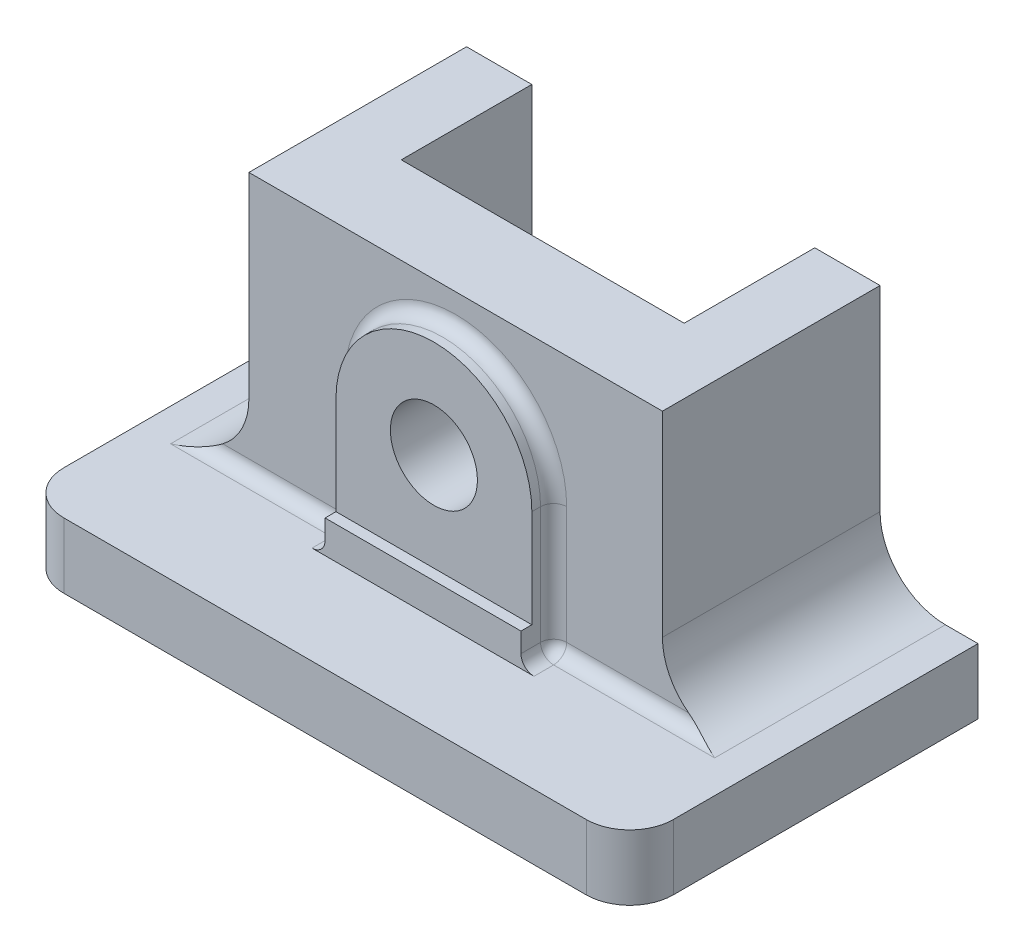
ISO-10303-21;
HEADER;
FILE_DESCRIPTION(('STEP AP214'),'2;1');
FILE_NAME('part.step','',(''),(''),'','','');
FILE_SCHEMA(('AUTOMOTIVE_DESIGN { 1 0 10303 214 1 1 1 1 }'));
ENDSEC;
DATA;
#1=APPLICATION_CONTEXT('core data for automotive mechanical design processes');
#2=APPLICATION_PROTOCOL_DEFINITION('international standard','automotive_design',2000,#1);
#3=PRODUCT_CONTEXT('',#1,'mechanical');
#4=PRODUCT('Part','Part','',(#3));
#5=PRODUCT_RELATED_PRODUCT_CATEGORY('part','',(#4));
#6=PRODUCT_DEFINITION_FORMATION('','',#4);
#7=PRODUCT_DEFINITION_CONTEXT('part definition',#1,'design');
#8=PRODUCT_DEFINITION('design','',#6,#7);
#9=PRODUCT_DEFINITION_SHAPE('','',#8);
#10=(LENGTH_UNIT() NAMED_UNIT(*) SI_UNIT(.MILLI.,.METRE.));
#11=(NAMED_UNIT(*) PLANE_ANGLE_UNIT() SI_UNIT($,.RADIAN.));
#12=(NAMED_UNIT(*) SI_UNIT($,.STERADIAN.) SOLID_ANGLE_UNIT());
#13=UNCERTAINTY_MEASURE_WITH_UNIT(LENGTH_MEASURE(1.E-05),#10,'distance_accuracy_value','');
#14=(GEOMETRIC_REPRESENTATION_CONTEXT(3) GLOBAL_UNCERTAINTY_ASSIGNED_CONTEXT((#13)) GLOBAL_UNIT_ASSIGNED_CONTEXT((#10,
#11,#12)) REPRESENTATION_CONTEXT('',''));
#15=CARTESIAN_POINT('',(0.,0.,0.));
#16=DIRECTION('',(0.,0.,1.));
#17=DIRECTION('',(1.,0.,0.));
#18=AXIS2_PLACEMENT_3D('',#15,#16,#17);
#19=CARTESIAN_POINT('',(-38.1,9.525,19.05));
#20=DIRECTION('',(0.,-1.,0.));
#21=DIRECTION('',(0.,0.,-1.));
#22=AXIS2_PLACEMENT_3D('',#19,#20,#21);
#23=PLANE('',#22);
#24=DIRECTION('',(1.,0.,0.));
#25=VECTOR('',#24,1.);
#26=CARTESIAN_POINT('',(0.,9.525,11.1125));
#27=LINE('',#26,#25);
#28=CARTESIAN_POINT('',(-16.1925,9.525,11.1125));
#29=VERTEX_POINT('',#28);
#30=CARTESIAN_POINT('',(16.1925,9.525,11.1125));
#31=VERTEX_POINT('',#30);
#32=EDGE_CURVE('E232',#29,#31,#27,.T.);
#33=ORIENTED_EDGE('',*,*,#32,.F.);
#34=DIRECTION('',(0.,0.,-1.));
#35=VECTOR('',#34,1.);
#36=CARTESIAN_POINT('',(-16.1925,9.525,19.05));
#37=LINE('',#36,#35);
#38=CARTESIAN_POINT('',(-16.1925,9.525,8.25499999999999));
#39=VERTEX_POINT('',#38);
#40=EDGE_CURVE('E415',#29,#39,#37,.T.);
#41=ORIENTED_EDGE('',*,*,#40,.T.);
#42=DIRECTION('',(1.,0.,0.));
#43=VECTOR('',#42,1.);
#44=CARTESIAN_POINT('',(-39.6875,9.525,8.25499999999999));
#45=LINE('',#44,#43);
#46=CARTESIAN_POINT('',(-39.6875,9.525,8.25499999999999));
#47=VERTEX_POINT('',#46);
#48=EDGE_CURVE('E412',#39,#47,#45,.F.);
#49=ORIENTED_EDGE('',*,*,#48,.T.);
#50=DIRECTION('',(0.,0.,1.));
#51=VECTOR('',#50,1.);
#52=CARTESIAN_POINT('',(-39.6875,9.525,-25.4));
#53=LINE('',#52,#51);
#54=CARTESIAN_POINT('',(-39.6875,9.525,-25.4));
#55=VERTEX_POINT('',#54);
#56=EDGE_CURVE('E375',#47,#55,#53,.F.);
#57=ORIENTED_EDGE('',*,*,#56,.T.);
#58=DIRECTION('',(-1.,0.,0.));
#59=VECTOR('',#58,1.);
#60=CARTESIAN_POINT('',(-44.45,9.525,-25.4));
#61=LINE('',#60,#59);
#62=CARTESIAN_POINT('',(-44.45,9.525,-25.4));
#63=VERTEX_POINT('',#62);
#64=EDGE_CURVE('E323',#55,#63,#61,.T.);
#65=ORIENTED_EDGE('',*,*,#64,.T.);
#66=DIRECTION('',(0.,0.,1.));
#67=VECTOR('',#66,1.);
#68=CARTESIAN_POINT('',(-44.45,9.525,19.05));
#69=LINE('',#68,#67);
#70=CARTESIAN_POINT('',(-44.45,9.525,19.05));
#71=VERTEX_POINT('',#70);
#72=EDGE_CURVE('E328',#63,#71,#69,.T.);
#73=ORIENTED_EDGE('',*,*,#72,.T.);
#74=CARTESIAN_POINT('',(-38.1,9.525,19.05));
#75=DIRECTION('',(0.,1.,0.));
#76=DIRECTION('',(0.,0.,-1.));
#77=AXIS2_PLACEMENT_3D('',#74,#75,#76);
#78=CIRCLE('',#77,6.35);
#79=CARTESIAN_POINT('',(-38.0999999999999,9.525,25.4));
#80=VERTEX_POINT('',#79);
#81=EDGE_CURVE('E331',#71,#80,#78,.T.);
#82=ORIENTED_EDGE('',*,*,#81,.T.);
#83=DIRECTION('',(1.,0.,0.));
#84=VECTOR('',#83,1.);
#85=CARTESIAN_POINT('',(-38.0999999999999,9.525,25.4));
#86=LINE('',#85,#84);
#87=CARTESIAN_POINT('',(38.1,9.525,25.4));
#88=VERTEX_POINT('',#87);
#89=EDGE_CURVE('E333',#80,#88,#86,.T.);
#90=ORIENTED_EDGE('',*,*,#89,.T.);
#91=CARTESIAN_POINT('',(38.1,9.525,19.05));
#92=DIRECTION('',(0.,1.,0.));
#93=DIRECTION('',(0.,0.,1.));
#94=AXIS2_PLACEMENT_3D('',#91,#92,#93);
#95=CIRCLE('',#94,6.35);
#96=CARTESIAN_POINT('',(44.45,9.525,19.05));
#97=VERTEX_POINT('',#96);
#98=EDGE_CURVE('E335',#88,#97,#95,.T.);
#99=ORIENTED_EDGE('',*,*,#98,.T.);
#100=DIRECTION('',(0.,0.,-1.));
#101=VECTOR('',#100,1.);
#102=CARTESIAN_POINT('',(44.45,9.525,19.05));
#103=LINE('',#102,#101);
#104=CARTESIAN_POINT('',(44.45,9.525,-25.4));
#105=VERTEX_POINT('',#104);
#106=EDGE_CURVE('E320',#97,#105,#103,.T.);
#107=ORIENTED_EDGE('',*,*,#106,.T.);
#108=CARTESIAN_POINT('',(39.6875,9.525,-25.4));
#109=VERTEX_POINT('',#108);
#110=EDGE_CURVE('E325',#105,#109,#61,.T.);
#111=ORIENTED_EDGE('',*,*,#110,.T.);
#112=DIRECTION('',(0.,0.,-1.));
#113=VECTOR('',#112,1.);
#114=CARTESIAN_POINT('',(39.6875,9.525,6.34999999999999));
#115=LINE('',#114,#113);
#116=CARTESIAN_POINT('',(39.6875,9.525,8.25499999999999));
#117=VERTEX_POINT('',#116);
#118=EDGE_CURVE('E373',#109,#117,#115,.F.);
#119=ORIENTED_EDGE('',*,*,#118,.T.);
#120=DIRECTION('',(1.,0.,0.));
#121=VECTOR('',#120,1.);
#122=CARTESIAN_POINT('',(16.1925,9.525,8.25499999999999));
#123=LINE('',#122,#121);
#124=CARTESIAN_POINT('',(16.1925,9.525,8.25499999999999));
#125=VERTEX_POINT('',#124);
#126=EDGE_CURVE('E401',#117,#125,#123,.F.);
#127=ORIENTED_EDGE('',*,*,#126,.T.);
#128=DIRECTION('',(0.,0.,-1.));
#129=VECTOR('',#128,1.);
#130=CARTESIAN_POINT('',(16.1925,9.525,19.05));
#131=LINE('',#130,#129);
#132=EDGE_CURVE('E409',#125,#31,#131,.F.);
#133=ORIENTED_EDGE('',*,*,#132,.T.);
#134=EDGE_LOOP('',(#33,#41,#49,#57,#65,#73,#82,#90,#99,#107,#111,#119,#127,#133));
#135=FACE_BOUND('',#134,.T.);
#136=ADVANCED_FACE('F39',(#135),#23,.F.);
#137=CARTESIAN_POINT('',(30.1625,47.625,6.34999999999999));
#138=DIRECTION('',(0.,0.,-1.));
#139=DIRECTION('',(-1.,0.,0.));
#140=AXIS2_PLACEMENT_3D('',#137,#138,#139);
#141=PLANE('',#140);
#142=CARTESIAN_POINT('',(-39.6875,19.05,6.34999999999999));
#143=DIRECTION('',(0.,0.,-1.));
#144=DIRECTION('',(-1.,0.,0.));
#145=AXIS2_PLACEMENT_3D('',#142,#143,#144);
#146=CIRCLE('',#145,9.525);
#147=CARTESIAN_POINT('',(-30.1625,19.05,6.34999999999999));
#148=VERTEX_POINT('',#147);
#149=CARTESIAN_POINT('',(-33.9725,11.43,6.34999999999999));
#150=VERTEX_POINT('',#149);
#151=EDGE_CURVE('E380',#148,#150,#146,.T.);
#152=ORIENTED_EDGE('',*,*,#151,.T.);
#153=DIRECTION('',(1.,0.,0.));
#154=VECTOR('',#153,1.);
#155=CARTESIAN_POINT('',(-16.1925,11.43,6.34999999999999));
#156=LINE('',#155,#154);
#157=CARTESIAN_POINT('',(-16.1925,11.43,6.34999999999999));
#158=VERTEX_POINT('',#157);
#159=EDGE_CURVE('E427',#150,#158,#156,.T.);
#160=ORIENTED_EDGE('',*,*,#159,.T.);
#161=DIRECTION('',(0.,1.,0.));
#162=VECTOR('',#161,1.);
#163=CARTESIAN_POINT('',(-16.1925,47.625,6.34999999999999));
#164=LINE('',#163,#162);
#165=CARTESIAN_POINT('',(-16.1925,28.575,6.34999999999999));
#166=VERTEX_POINT('',#165);
#167=EDGE_CURVE('E390',#158,#166,#164,.T.);
#168=ORIENTED_EDGE('',*,*,#167,.T.);
#169=CARTESIAN_POINT('',(0.,28.575,6.34999999999999));
#170=DIRECTION('',(0.,0.,-1.));
#171=DIRECTION('',(-1.,0.,0.));
#172=AXIS2_PLACEMENT_3D('',#169,#170,#171);
#173=CIRCLE('',#172,16.1925);
#174=CARTESIAN_POINT('',(16.1925,28.575,6.34999999999999));
#175=VERTEX_POINT('',#174);
#176=EDGE_CURVE('E388',#166,#175,#173,.T.);
#177=ORIENTED_EDGE('',*,*,#176,.T.);
#178=DIRECTION('',(0.,-1.,0.));
#179=VECTOR('',#178,1.);
#180=CARTESIAN_POINT('',(16.1925,47.625,6.34999999999999));
#181=LINE('',#180,#179);
#182=CARTESIAN_POINT('',(16.1925,11.43,6.34999999999999));
#183=VERTEX_POINT('',#182);
#184=EDGE_CURVE('E392',#175,#183,#181,.T.);
#185=ORIENTED_EDGE('',*,*,#184,.T.);
#186=DIRECTION('',(1.,0.,0.));
#187=VECTOR('',#186,1.);
#188=CARTESIAN_POINT('',(39.6875,11.43,6.34999999999999));
#189=LINE('',#188,#187);
#190=CARTESIAN_POINT('',(33.9725,11.43,6.34999999999999));
#191=VERTEX_POINT('',#190);
#192=EDGE_CURVE('E64',#183,#191,#189,.T.);
#193=ORIENTED_EDGE('',*,*,#192,.T.);
#194=CARTESIAN_POINT('',(39.6875,19.05,6.34999999999999));
#195=DIRECTION('',(0.,0.,-1.));
#196=DIRECTION('',(-1.,0.,0.));
#197=AXIS2_PLACEMENT_3D('',#194,#195,#196);
#198=CIRCLE('',#197,9.525);
#199=CARTESIAN_POINT('',(30.1625,19.05,6.34999999999999));
#200=VERTEX_POINT('',#199);
#201=EDGE_CURVE('E386',#191,#200,#198,.T.);
#202=ORIENTED_EDGE('',*,*,#201,.T.);
#203=DIRECTION('',(0.,-1.,0.));
#204=VECTOR('',#203,1.);
#205=CARTESIAN_POINT('',(30.1625,47.625,6.34999999999999));
#206=LINE('',#205,#204);
#207=CARTESIAN_POINT('',(30.1625,47.625,6.34999999999999));
#208=VERTEX_POINT('',#207);
#209=EDGE_CURVE('E301',#208,#200,#206,.T.);
#210=ORIENTED_EDGE('',*,*,#209,.F.);
#211=DIRECTION('',(1.,0.,0.));
#212=VECTOR('',#211,1.);
#213=CARTESIAN_POINT('',(30.1625,47.625,6.34999999999999));
#214=LINE('',#213,#212);
#215=CARTESIAN_POINT('',(-30.1625,47.625,6.34999999999999));
#216=VERTEX_POINT('',#215);
#217=EDGE_CURVE('E282',#216,#208,#214,.T.);
#218=ORIENTED_EDGE('',*,*,#217,.F.);
#219=DIRECTION('',(0.,-1.,0.));
#220=VECTOR('',#219,1.);
#221=CARTESIAN_POINT('',(-30.1625,47.625,6.34999999999999));
#222=LINE('',#221,#220);
#223=EDGE_CURVE('E304',#216,#148,#222,.T.);
#224=ORIENTED_EDGE('',*,*,#223,.T.);
#225=EDGE_LOOP('',(#152,#160,#168,#177,#185,#193,#202,#210,#218,#224));
#226=FACE_BOUND('',#225,.T.);
#227=ADVANCED_FACE('F482',(#226),#141,.F.);
#228=DIRECTION('',(0.,0.,1.));
#229=VECTOR('',#228,1.);
#230=CARTESIAN_POINT('',(20.6375,9.525,-6.35000000000001));
#231=LINE('',#230,#229);
#232=CARTESIAN_POINT('',(20.6375,9.525,-25.4));
#233=VERTEX_POINT('',#232);
#234=CARTESIAN_POINT('',(20.6375,9.525,-6.35000000000001));
#235=VERTEX_POINT('',#234);
#236=EDGE_CURVE('E269',#233,#235,#231,.T.);
#237=ORIENTED_EDGE('',*,*,#236,.F.);
#238=CARTESIAN_POINT('',(-20.6375,9.525,-25.4));
#239=VERTEX_POINT('',#238);
#240=EDGE_CURVE('E329',#233,#239,#61,.T.);
#241=ORIENTED_EDGE('',*,*,#240,.T.);
#242=DIRECTION('',(0.,0.,-1.));
#243=VECTOR('',#242,1.);
#244=CARTESIAN_POINT('',(-20.6375,9.525,-25.4));
#245=LINE('',#244,#243);
#246=CARTESIAN_POINT('',(-20.6375,9.525,-6.35));
#247=VERTEX_POINT('',#246);
#248=EDGE_CURVE('E274',#247,#239,#245,.T.);
#249=ORIENTED_EDGE('',*,*,#248,.F.);
#250=DIRECTION('',(-1.,0.,0.));
#251=VECTOR('',#250,1.);
#252=CARTESIAN_POINT('',(-20.6375,9.525,-6.35));
#253=LINE('',#252,#251);
#254=EDGE_CURVE('E291',#235,#247,#253,.T.);
#255=ORIENTED_EDGE('',*,*,#254,.F.);
#256=EDGE_LOOP('',(#237,#241,#249,#255));
#257=FACE_BOUND('',#256,.T.);
#258=ADVANCED_FACE('F485',(#257),#23,.F.);
#259=CARTESIAN_POINT('',(44.45,9.525,19.05));
#260=DIRECTION('',(-1.,0.,0.));
#261=DIRECTION('',(0.,0.,1.));
#262=AXIS2_PLACEMENT_3D('',#259,#260,#261);
#263=PLANE('',#262);
#264=DIRECTION('',(0.,0.,-1.));
#265=VECTOR('',#264,1.);
#266=CARTESIAN_POINT('',(44.45,0.,19.05));
#267=LINE('',#266,#265);
#268=CARTESIAN_POINT('',(44.45,0.,19.05));
#269=VERTEX_POINT('',#268);
#270=CARTESIAN_POINT('',(44.45,0.,-25.4));
#271=VERTEX_POINT('',#270);
#272=EDGE_CURVE('E319',#269,#271,#267,.T.);
#273=ORIENTED_EDGE('',*,*,#272,.T.);
#274=DIRECTION('',(0.,-1.,0.));
#275=VECTOR('',#274,1.);
#276=CARTESIAN_POINT('',(44.45,9.525,-25.4));
#277=LINE('',#276,#275);
#278=EDGE_CURVE('E363',#105,#271,#277,.T.);
#279=ORIENTED_EDGE('',*,*,#278,.F.);
#280=ORIENTED_EDGE('',*,*,#106,.F.);
#281=DIRECTION('',(0.,-1.,0.));
#282=VECTOR('',#281,1.);
#283=CARTESIAN_POINT('',(44.45,9.525,19.05));
#284=LINE('',#283,#282);
#285=EDGE_CURVE('E337',#97,#269,#284,.T.);
#286=ORIENTED_EDGE('',*,*,#285,.T.);
#287=EDGE_LOOP('',(#273,#279,#280,#286));
#288=FACE_BOUND('',#287,.T.);
#289=ADVANCED_FACE('F452',(#288),#263,.F.);
#290=CARTESIAN_POINT('',(-44.45,9.525,-25.4));
#291=DIRECTION('',(0.,0.,1.));
#292=DIRECTION('',(1.,0.,0.));
#293=AXIS2_PLACEMENT_3D('',#290,#291,#292);
#294=PLANE('',#293);
#295=DIRECTION('',(-1.,0.,0.));
#296=VECTOR('',#295,1.);
#297=CARTESIAN_POINT('',(-44.45,0.,-25.4));
#298=LINE('',#297,#296);
#299=CARTESIAN_POINT('',(-44.45,0.,-25.4));
#300=VERTEX_POINT('',#299);
#301=EDGE_CURVE('E340',#271,#300,#298,.T.);
#302=ORIENTED_EDGE('',*,*,#301,.T.);
#303=DIRECTION('',(0.,-1.,0.));
#304=VECTOR('',#303,1.);
#305=CARTESIAN_POINT('',(-44.45,9.525,-25.4));
#306=LINE('',#305,#304);
#307=EDGE_CURVE('E360',#63,#300,#306,.T.);
#308=ORIENTED_EDGE('',*,*,#307,.F.);
#309=ORIENTED_EDGE('',*,*,#64,.F.);
#310=CARTESIAN_POINT('',(-39.6875,19.05,-25.4));
#311=DIRECTION('',(0.,0.,1.));
#312=DIRECTION('',(1.,0.,0.));
#313=AXIS2_PLACEMENT_3D('',#310,#311,#312);
#314=CIRCLE('',#313,9.525);
#315=CARTESIAN_POINT('',(-30.1625,19.05,-25.4));
#316=VERTEX_POINT('',#315);
#317=EDGE_CURVE('E382',#55,#316,#314,.T.);
#318=ORIENTED_EDGE('',*,*,#317,.T.);
#319=DIRECTION('',(0.,-1.,0.));
#320=VECTOR('',#319,1.);
#321=CARTESIAN_POINT('',(-30.1625,47.625,-25.4));
#322=LINE('',#321,#320);
#323=CARTESIAN_POINT('',(-30.1625,47.625,-25.4));
#324=VERTEX_POINT('',#323);
#325=EDGE_CURVE('E307',#324,#316,#322,.T.);
#326=ORIENTED_EDGE('',*,*,#325,.F.);
#327=DIRECTION('',(-1.,0.,0.));
#328=VECTOR('',#327,1.);
#329=CARTESIAN_POINT('',(-30.1625,47.625,-25.4));
#330=LINE('',#329,#328);
#331=CARTESIAN_POINT('',(-20.6375,47.625,-25.4));
#332=VERTEX_POINT('',#331);
#333=EDGE_CURVE('E278',#332,#324,#330,.T.);
#334=ORIENTED_EDGE('',*,*,#333,.F.);
#335=DIRECTION('',(0.,-1.,0.));
#336=VECTOR('',#335,1.);
#337=CARTESIAN_POINT('',(-20.6375,47.625,-25.4));
#338=LINE('',#337,#336);
#339=EDGE_CURVE('E310',#332,#239,#338,.T.);
#340=ORIENTED_EDGE('',*,*,#339,.T.);
#341=ORIENTED_EDGE('',*,*,#240,.F.);
#342=DIRECTION('',(0.,-1.,0.));
#343=VECTOR('',#342,1.);
#344=CARTESIAN_POINT('',(20.6375,47.625,-25.4));
#345=LINE('',#344,#343);
#346=CARTESIAN_POINT('',(20.6375,47.625,-25.4));
#347=VERTEX_POINT('',#346);
#348=EDGE_CURVE('E288',#347,#233,#345,.T.);
#349=ORIENTED_EDGE('',*,*,#348,.F.);
#350=DIRECTION('',(-1.,0.,0.));
#351=VECTOR('',#350,1.);
#352=CARTESIAN_POINT('',(20.6375,47.625,-25.4));
#353=LINE('',#352,#351);
#354=CARTESIAN_POINT('',(30.1625,47.625,-25.4));
#355=VERTEX_POINT('',#354);
#356=EDGE_CURVE('E286',#355,#347,#353,.T.);
#357=ORIENTED_EDGE('',*,*,#356,.F.);
#358=DIRECTION('',(0.,-1.,0.));
#359=VECTOR('',#358,1.);
#360=CARTESIAN_POINT('',(30.1625,47.625,-25.4));
#361=LINE('',#360,#359);
#362=CARTESIAN_POINT('',(30.1625,19.05,-25.4));
#363=VERTEX_POINT('',#362);
#364=EDGE_CURVE('E298',#355,#363,#361,.T.);
#365=ORIENTED_EDGE('',*,*,#364,.T.);
#366=CARTESIAN_POINT('',(39.6875,19.05,-25.4));
#367=DIRECTION('',(0.,0.,1.));
#368=DIRECTION('',(1.,0.,0.));
#369=AXIS2_PLACEMENT_3D('',#366,#367,#368);
#370=CIRCLE('',#369,9.525);
#371=EDGE_CURVE('E384',#363,#109,#370,.T.);
#372=ORIENTED_EDGE('',*,*,#371,.T.);
#373=ORIENTED_EDGE('',*,*,#110,.F.);
#374=ORIENTED_EDGE('',*,*,#278,.T.);
#375=EDGE_LOOP('',(#302,#308,#309,#318,#326,#334,#340,#341,#349,#357,#365,#372,#373,#374));
#376=FACE_BOUND('',#375,.T.);
#377=ADVANCED_FACE('F497',(#376),#294,.F.);
#378=CARTESIAN_POINT('',(-44.45,9.525,19.05));
#379=DIRECTION('',(1.,0.,0.));
#380=DIRECTION('',(0.,0.,-1.));
#381=AXIS2_PLACEMENT_3D('',#378,#379,#380);
#382=PLANE('',#381);
#383=DIRECTION('',(0.,0.,1.));
#384=VECTOR('',#383,1.);
#385=CARTESIAN_POINT('',(-44.45,0.,19.05));
#386=LINE('',#385,#384);
#387=CARTESIAN_POINT('',(-44.45,0.,19.05));
#388=VERTEX_POINT('',#387);
#389=EDGE_CURVE('E342',#300,#388,#386,.T.);
#390=ORIENTED_EDGE('',*,*,#389,.T.);
#391=DIRECTION('',(0.,-1.,0.));
#392=VECTOR('',#391,1.);
#393=CARTESIAN_POINT('',(-44.45,9.525,19.05));
#394=LINE('',#393,#392);
#395=EDGE_CURVE('E357',#71,#388,#394,.T.);
#396=ORIENTED_EDGE('',*,*,#395,.F.);
#397=ORIENTED_EDGE('',*,*,#72,.F.);
#398=ORIENTED_EDGE('',*,*,#307,.T.);
#399=EDGE_LOOP('',(#390,#396,#397,#398));
#400=FACE_BOUND('',#399,.T.);
#401=ADVANCED_FACE('F535',(#400),#382,.F.);
#402=CARTESIAN_POINT('',(-38.1,9.525,19.05));
#403=DIRECTION('',(0.,-1.,0.));
#404=DIRECTION('',(0.,0.,-1.));
#405=AXIS2_PLACEMENT_3D('',#402,#403,#404);
#406=CYLINDRICAL_SURFACE('',#405,6.35);
#407=CARTESIAN_POINT('',(-38.1,0.,19.05));
#408=DIRECTION('',(0.,1.,0.));
#409=DIRECTION('',(0.,0.,-1.));
#410=AXIS2_PLACEMENT_3D('',#407,#408,#409);
#411=CIRCLE('',#410,6.35);
#412=CARTESIAN_POINT('',(-38.0999999999999,0.,25.4));
#413=VERTEX_POINT('',#412);
#414=EDGE_CURVE('E344',#388,#413,#411,.T.);
#415=ORIENTED_EDGE('',*,*,#414,.T.);
#416=DIRECTION('',(0.,-1.,0.));
#417=VECTOR('',#416,1.);
#418=CARTESIAN_POINT('',(-38.0999999999999,9.525,25.4));
#419=LINE('',#418,#417);
#420=EDGE_CURVE('E354',#80,#413,#419,.T.);
#421=ORIENTED_EDGE('',*,*,#420,.F.);
#422=ORIENTED_EDGE('',*,*,#81,.F.);
#423=ORIENTED_EDGE('',*,*,#395,.T.);
#424=EDGE_LOOP('',(#415,#421,#422,#423));
#425=FACE_BOUND('',#424,.T.);
#426=ADVANCED_FACE('F539',(#425),#406,.T.);
#427=CARTESIAN_POINT('',(-38.0999999999999,9.525,25.4));
#428=DIRECTION('',(0.,0.,-1.));
#429=DIRECTION('',(-1.,0.,0.));
#430=AXIS2_PLACEMENT_3D('',#427,#428,#429);
#431=PLANE('',#430);
#432=DIRECTION('',(1.,0.,0.));
#433=VECTOR('',#432,1.);
#434=CARTESIAN_POINT('',(-38.0999999999999,0.,25.4));
#435=LINE('',#434,#433);
#436=CARTESIAN_POINT('',(38.1,0.,25.4));
#437=VERTEX_POINT('',#436);
#438=EDGE_CURVE('E346',#413,#437,#435,.T.);
#439=ORIENTED_EDGE('',*,*,#438,.T.);
#440=DIRECTION('',(0.,-1.,0.));
#441=VECTOR('',#440,1.);
#442=CARTESIAN_POINT('',(38.1,9.525,25.4));
#443=LINE('',#442,#441);
#444=EDGE_CURVE('E351',#88,#437,#443,.T.);
#445=ORIENTED_EDGE('',*,*,#444,.F.);
#446=ORIENTED_EDGE('',*,*,#89,.F.);
#447=ORIENTED_EDGE('',*,*,#420,.T.);
#448=EDGE_LOOP('',(#439,#445,#446,#447));
#449=FACE_BOUND('',#448,.T.);
#450=ADVANCED_FACE('F818',(#449),#431,.F.);
#451=CARTESIAN_POINT('',(38.1,9.525,19.05));
#452=DIRECTION('',(0.,-1.,0.));
#453=DIRECTION('',(0.,0.,-1.));
#454=AXIS2_PLACEMENT_3D('',#451,#452,#453);
#455=CYLINDRICAL_SURFACE('',#454,6.35);
#456=CARTESIAN_POINT('',(38.1,0.,19.05));
#457=DIRECTION('',(0.,1.,0.));
#458=DIRECTION('',(0.,0.,1.));
#459=AXIS2_PLACEMENT_3D('',#456,#457,#458);
#460=CIRCLE('',#459,6.35);
#461=EDGE_CURVE('E324',#437,#269,#460,.T.);
#462=ORIENTED_EDGE('',*,*,#461,.T.);
#463=ORIENTED_EDGE('',*,*,#285,.F.);
#464=ORIENTED_EDGE('',*,*,#98,.F.);
#465=ORIENTED_EDGE('',*,*,#444,.T.);
#466=EDGE_LOOP('',(#462,#463,#464,#465));
#467=FACE_BOUND('',#466,.T.);
#468=ADVANCED_FACE('F825',(#467),#455,.T.);
#469=CARTESIAN_POINT('',(-38.1,0.,19.05));
#470=DIRECTION('',(0.,-1.,0.));
#471=DIRECTION('',(0.,0.,-1.));
#472=AXIS2_PLACEMENT_3D('',#469,#470,#471);
#473=PLANE('',#472);
#474=ORIENTED_EDGE('',*,*,#272,.F.);
#475=ORIENTED_EDGE('',*,*,#461,.F.);
#476=ORIENTED_EDGE('',*,*,#438,.F.);
#477=ORIENTED_EDGE('',*,*,#414,.F.);
#478=ORIENTED_EDGE('',*,*,#389,.F.);
#479=ORIENTED_EDGE('',*,*,#301,.F.);
#480=EDGE_LOOP('',(#474,#475,#476,#477,#478,#479));
#481=FACE_BOUND('',#480,.T.);
#482=ADVANCED_FACE('F529',(#481),#473,.T.);
#483=CARTESIAN_POINT('',(20.6375,47.625,-6.35000000000001));
#484=DIRECTION('',(1.,0.,0.));
#485=DIRECTION('',(0.,0.,-1.));
#486=AXIS2_PLACEMENT_3D('',#483,#484,#485);
#487=PLANE('',#486);
#488=ORIENTED_EDGE('',*,*,#236,.T.);
#489=DIRECTION('',(0.,-1.,0.));
#490=VECTOR('',#489,1.);
#491=CARTESIAN_POINT('',(20.6375,47.625,-6.35000000000001));
#492=LINE('',#491,#490);
#493=CARTESIAN_POINT('',(20.6375,47.625,-6.35000000000001));
#494=VERTEX_POINT('',#493);
#495=EDGE_CURVE('E316',#494,#235,#492,.T.);
#496=ORIENTED_EDGE('',*,*,#495,.F.);
#497=DIRECTION('',(0.,0.,1.));
#498=VECTOR('',#497,1.);
#499=CARTESIAN_POINT('',(20.6375,47.625,-6.35000000000001));
#500=LINE('',#499,#498);
#501=EDGE_CURVE('E270',#347,#494,#500,.T.);
#502=ORIENTED_EDGE('',*,*,#501,.F.);
#503=ORIENTED_EDGE('',*,*,#348,.T.);
#504=EDGE_LOOP('',(#488,#496,#502,#503));
#505=FACE_BOUND('',#504,.T.);
#506=ADVANCED_FACE('F508',(#505),#487,.F.);
#507=CARTESIAN_POINT('',(-20.6375,47.625,-6.35));
#508=DIRECTION('',(0.,0.,1.));
#509=DIRECTION('',(1.,0.,0.));
#510=AXIS2_PLACEMENT_3D('',#507,#508,#509);
#511=PLANE('',#510);
#512=CARTESIAN_POINT('',(0.,28.575,-6.35));
#513=DIRECTION('',(0.,0.,1.));
#514=DIRECTION('',(1.,0.,0.));
#515=AXIS2_PLACEMENT_3D('',#512,#513,#514);
#516=CIRCLE('',#515,6.35);
#517=CARTESIAN_POINT('',(6.35,28.575,-6.35000000000001));
#518=VERTEX_POINT('',#517);
#519=EDGE_CURVE('E367',#518,#518,#516,.T.);
#520=ORIENTED_EDGE('',*,*,#519,.T.);
#521=EDGE_LOOP('',(#520));
#522=FACE_BOUND('',#521,.T.);
#523=ORIENTED_EDGE('',*,*,#254,.T.);
#524=DIRECTION('',(0.,-1.,0.));
#525=VECTOR('',#524,1.);
#526=CARTESIAN_POINT('',(-20.6375,47.625,-6.35));
#527=LINE('',#526,#525);
#528=CARTESIAN_POINT('',(-20.6375,47.625,-6.35));
#529=VERTEX_POINT('',#528);
#530=EDGE_CURVE('E313',#529,#247,#527,.T.);
#531=ORIENTED_EDGE('',*,*,#530,.F.);
#532=DIRECTION('',(-1.,0.,0.));
#533=VECTOR('',#532,1.);
#534=CARTESIAN_POINT('',(-20.6375,47.625,-6.35));
#535=LINE('',#534,#533);
#536=EDGE_CURVE('E273',#494,#529,#535,.T.);
#537=ORIENTED_EDGE('',*,*,#536,.F.);
#538=ORIENTED_EDGE('',*,*,#495,.T.);
#539=EDGE_LOOP('',(#523,#531,#537,#538));
#540=FACE_BOUND('',#539,.T.);
#541=ADVANCED_FACE('F557',(#522,#540),#511,.F.);
#542=CARTESIAN_POINT('',(-20.6375,47.625,-25.4));
#543=DIRECTION('',(-1.,0.,0.));
#544=DIRECTION('',(0.,0.,1.));
#545=AXIS2_PLACEMENT_3D('',#542,#543,#544);
#546=PLANE('',#545);
#547=ORIENTED_EDGE('',*,*,#248,.T.);
#548=ORIENTED_EDGE('',*,*,#339,.F.);
#549=DIRECTION('',(0.,0.,-1.));
#550=VECTOR('',#549,1.);
#551=CARTESIAN_POINT('',(-20.6375,47.625,-25.4));
#552=LINE('',#551,#550);
#553=EDGE_CURVE('E276',#529,#332,#552,.T.);
#554=ORIENTED_EDGE('',*,*,#553,.F.);
#555=ORIENTED_EDGE('',*,*,#530,.T.);
#556=EDGE_LOOP('',(#547,#548,#554,#555));
#557=FACE_BOUND('',#556,.T.);
#558=ADVANCED_FACE('F555',(#557),#546,.F.);
#559=CARTESIAN_POINT('',(-30.1625,47.625,6.34999999999999));
#560=DIRECTION('',(1.,0.,0.));
#561=DIRECTION('',(0.,0.,-1.));
#562=AXIS2_PLACEMENT_3D('',#559,#560,#561);
#563=PLANE('',#562);
#564=ORIENTED_EDGE('',*,*,#325,.T.);
#565=DIRECTION('',(0.,0.,1.));
#566=VECTOR('',#565,1.);
#567=CARTESIAN_POINT('',(-30.1625,19.05,6.34999999999999));
#568=LINE('',#567,#566);
#569=EDGE_CURVE('E366',#316,#148,#568,.T.);
#570=ORIENTED_EDGE('',*,*,#569,.T.);
#571=ORIENTED_EDGE('',*,*,#223,.F.);
#572=DIRECTION('',(0.,0.,1.));
#573=VECTOR('',#572,1.);
#574=CARTESIAN_POINT('',(-30.1625,47.625,6.34999999999999));
#575=LINE('',#574,#573);
#576=EDGE_CURVE('E280',#324,#216,#575,.T.);
#577=ORIENTED_EDGE('',*,*,#576,.F.);
#578=EDGE_LOOP('',(#564,#570,#571,#577));
#579=FACE_BOUND('',#578,.T.);
#580=ADVANCED_FACE('F549',(#579),#563,.F.);
#581=CARTESIAN_POINT('',(30.1625,47.625,-25.4));
#582=DIRECTION('',(-1.,0.,0.));
#583=DIRECTION('',(0.,0.,1.));
#584=AXIS2_PLACEMENT_3D('',#581,#582,#583);
#585=PLANE('',#584);
#586=ORIENTED_EDGE('',*,*,#209,.T.);
#587=DIRECTION('',(0.,0.,-1.));
#588=VECTOR('',#587,1.);
#589=CARTESIAN_POINT('',(30.1625,19.05,-25.4));
#590=LINE('',#589,#588);
#591=EDGE_CURVE('E377',#200,#363,#590,.T.);
#592=ORIENTED_EDGE('',*,*,#591,.T.);
#593=ORIENTED_EDGE('',*,*,#364,.F.);
#594=DIRECTION('',(0.,0.,-1.));
#595=VECTOR('',#594,1.);
#596=CARTESIAN_POINT('',(30.1625,47.625,-25.4));
#597=LINE('',#596,#595);
#598=EDGE_CURVE('E284',#208,#355,#597,.T.);
#599=ORIENTED_EDGE('',*,*,#598,.F.);
#600=EDGE_LOOP('',(#586,#592,#593,#599));
#601=FACE_BOUND('',#600,.T.);
#602=ADVANCED_FACE('F515',(#601),#585,.F.);
#603=CARTESIAN_POINT('',(0.,47.625,0.));
#604=DIRECTION('',(0.,-1.,0.));
#605=DIRECTION('',(0.,0.,-1.));
#606=AXIS2_PLACEMENT_3D('',#603,#604,#605);
#607=PLANE('',#606);
#608=ORIENTED_EDGE('',*,*,#501,.T.);
#609=ORIENTED_EDGE('',*,*,#536,.T.);
#610=ORIENTED_EDGE('',*,*,#553,.T.);
#611=ORIENTED_EDGE('',*,*,#333,.T.);
#612=ORIENTED_EDGE('',*,*,#576,.T.);
#613=ORIENTED_EDGE('',*,*,#217,.T.);
#614=ORIENTED_EDGE('',*,*,#598,.T.);
#615=ORIENTED_EDGE('',*,*,#356,.T.);
#616=EDGE_LOOP('',(#608,#609,#610,#611,#612,#613,#614,#615));
#617=FACE_BOUND('',#616,.T.);
#618=ADVANCED_FACE('F510',(#617),#607,.F.);
#619=CARTESIAN_POINT('',(14.2875,0.,9.52499999999999));
#620=DIRECTION('',(1.,0.,0.));
#621=DIRECTION('',(0.,0.,-1.));
#622=AXIS2_PLACEMENT_3D('',#619,#620,#621);
#623=PLANE('',#622);
#624=DIRECTION('',(0.,1.,0.));
#625=VECTOR('',#624,1.);
#626=CARTESIAN_POINT('',(14.2875,0.,11.1125));
#627=LINE('',#626,#625);
#628=CARTESIAN_POINT('',(14.2875,11.43,11.1125));
#629=VERTEX_POINT('',#628);
#630=CARTESIAN_POINT('',(14.2875,14.2875,11.1125));
#631=VERTEX_POINT('',#630);
#632=EDGE_CURVE('E221',#629,#631,#627,.T.);
#633=ORIENTED_EDGE('',*,*,#632,.F.);
#634=DIRECTION('',(0.,0.,-1.));
#635=VECTOR('',#634,1.);
#636=CARTESIAN_POINT('',(14.2875,11.43,9.52499999999999));
#637=LINE('',#636,#635);
#638=CARTESIAN_POINT('',(14.2875,11.43,8.25499999999999));
#639=VERTEX_POINT('',#638);
#640=EDGE_CURVE('E422',#629,#639,#637,.T.);
#641=ORIENTED_EDGE('',*,*,#640,.T.);
#642=DIRECTION('',(0.,-1.,0.));
#643=VECTOR('',#642,1.);
#644=CARTESIAN_POINT('',(14.2875,0.,8.25499999999999));
#645=LINE('',#644,#643);
#646=CARTESIAN_POINT('',(14.2875,28.575,8.25499999999999));
#647=VERTEX_POINT('',#646);
#648=EDGE_CURVE('E394',#639,#647,#645,.F.);
#649=ORIENTED_EDGE('',*,*,#648,.T.);
#650=DIRECTION('',(0.,0.,-1.));
#651=VECTOR('',#650,1.);
#652=CARTESIAN_POINT('',(14.2875,28.575,9.52499999999999));
#653=LINE('',#652,#651);
#654=CARTESIAN_POINT('',(14.2875,28.575,9.52499999999999));
#655=VERTEX_POINT('',#654);
#656=EDGE_CURVE('E266',#655,#647,#653,.T.);
#657=ORIENTED_EDGE('',*,*,#656,.F.);
#658=DIRECTION('',(0.,-1.,0.));
#659=VECTOR('',#658,1.);
#660=CARTESIAN_POINT('',(14.2875,0.,9.52499999999999));
#661=LINE('',#660,#659);
#662=CARTESIAN_POINT('',(14.2875,14.2875,9.52499999999999));
#663=VERTEX_POINT('',#662);
#664=EDGE_CURVE('E238',#655,#663,#661,.T.);
#665=ORIENTED_EDGE('',*,*,#664,.T.);
#666=DIRECTION('',(0.,0.,-1.));
#667=VECTOR('',#666,1.);
#668=CARTESIAN_POINT('',(14.2875,14.2875,11.1125));
#669=LINE('',#668,#667);
#670=EDGE_CURVE('E235',#631,#663,#669,.T.);
#671=ORIENTED_EDGE('',*,*,#670,.F.);
#672=EDGE_LOOP('',(#633,#641,#649,#657,#665,#671));
#673=FACE_BOUND('',#672,.T.);
#674=ADVANCED_FACE('F236',(#673),#623,.T.);
#675=CARTESIAN_POINT('',(0.,28.575,9.52499999999999));
#676=DIRECTION('',(0.,0.,-1.));
#677=DIRECTION('',(-1.,0.,0.));
#678=AXIS2_PLACEMENT_3D('',#675,#676,#677);
#679=CYLINDRICAL_SURFACE('',#678,14.2875);
#680=ORIENTED_EDGE('',*,*,#656,.T.);
#681=CARTESIAN_POINT('',(0.,28.575,8.25499999999999));
#682=DIRECTION('',(0.,0.,-1.));
#683=DIRECTION('',(-1.,0.,0.));
#684=AXIS2_PLACEMENT_3D('',#681,#682,#683);
#685=CIRCLE('',#684,14.2875);
#686=CARTESIAN_POINT('',(-14.2875,28.575,8.25499999999999));
#687=VERTEX_POINT('',#686);
#688=EDGE_CURVE('E399',#647,#687,#685,.F.);
#689=ORIENTED_EDGE('',*,*,#688,.T.);
#690=DIRECTION('',(0.,0.,-1.));
#691=VECTOR('',#690,1.);
#692=CARTESIAN_POINT('',(-14.2875,28.575,9.52499999999999));
#693=LINE('',#692,#691);
#694=CARTESIAN_POINT('',(-14.2875,28.575,9.52499999999999));
#695=VERTEX_POINT('',#694);
#696=EDGE_CURVE('E263',#695,#687,#693,.T.);
#697=ORIENTED_EDGE('',*,*,#696,.F.);
#698=CARTESIAN_POINT('',(0.,28.575,9.52499999999999));
#699=DIRECTION('',(0.,0.,1.));
#700=DIRECTION('',(1.,0.,0.));
#701=AXIS2_PLACEMENT_3D('',#698,#699,#700);
#702=CIRCLE('',#701,14.2875);
#703=EDGE_CURVE('E256',#655,#695,#702,.T.);
#704=ORIENTED_EDGE('',*,*,#703,.F.);
#705=EDGE_LOOP('',(#680,#689,#697,#704));
#706=FACE_BOUND('',#705,.T.);
#707=ADVANCED_FACE('F581',(#706),#679,.T.);
#708=CARTESIAN_POINT('',(-14.2875,0.,9.52499999999999));
#709=DIRECTION('',(-1.,0.,0.));
#710=DIRECTION('',(0.,0.,1.));
#711=AXIS2_PLACEMENT_3D('',#708,#709,#710);
#712=PLANE('',#711);
#713=DIRECTION('',(0.,1.,0.));
#714=VECTOR('',#713,1.);
#715=CARTESIAN_POINT('',(-14.2875,0.,8.25499999999999));
#716=LINE('',#715,#714);
#717=CARTESIAN_POINT('',(-14.2875,11.43,8.25499999999999));
#718=VERTEX_POINT('',#717);
#719=EDGE_CURVE('E396',#687,#718,#716,.F.);
#720=ORIENTED_EDGE('',*,*,#719,.T.);
#721=DIRECTION('',(0.,0.,-1.));
#722=VECTOR('',#721,1.);
#723=CARTESIAN_POINT('',(-14.2875,11.43,9.52499999999999));
#724=LINE('',#723,#722);
#725=CARTESIAN_POINT('',(-14.2875,11.43,11.1125));
#726=VERTEX_POINT('',#725);
#727=EDGE_CURVE('E418',#718,#726,#724,.F.);
#728=ORIENTED_EDGE('',*,*,#727,.T.);
#729=DIRECTION('',(0.,-1.,0.));
#730=VECTOR('',#729,1.);
#731=CARTESIAN_POINT('',(-14.2875,0.,11.1125));
#732=LINE('',#731,#730);
#733=CARTESIAN_POINT('',(-14.2875,14.2875,11.1125));
#734=VERTEX_POINT('',#733);
#735=EDGE_CURVE('E247',#734,#726,#732,.T.);
#736=ORIENTED_EDGE('',*,*,#735,.F.);
#737=DIRECTION('',(0.,0.,-1.));
#738=VECTOR('',#737,1.);
#739=CARTESIAN_POINT('',(-14.2875,14.2875,11.1125));
#740=LINE('',#739,#738);
#741=CARTESIAN_POINT('',(-14.2875,14.2875,9.52499999999999));
#742=VERTEX_POINT('',#741);
#743=EDGE_CURVE('E242',#734,#742,#740,.T.);
#744=ORIENTED_EDGE('',*,*,#743,.T.);
#745=DIRECTION('',(0.,1.,0.));
#746=VECTOR('',#745,1.);
#747=CARTESIAN_POINT('',(-14.2875,0.,9.52499999999999));
#748=LINE('',#747,#746);
#749=EDGE_CURVE('E258',#742,#695,#748,.T.);
#750=ORIENTED_EDGE('',*,*,#749,.T.);
#751=ORIENTED_EDGE('',*,*,#696,.T.);
#752=EDGE_LOOP('',(#720,#728,#736,#744,#750,#751));
#753=FACE_BOUND('',#752,.T.);
#754=ADVANCED_FACE('F577',(#753),#712,.T.);
#755=CARTESIAN_POINT('',(0.,28.575,9.52499999999999));
#756=DIRECTION('',(0.,0.,-1.));
#757=DIRECTION('',(-1.,0.,0.));
#758=AXIS2_PLACEMENT_3D('',#755,#756,#757);
#759=CYLINDRICAL_SURFACE('',#758,6.35);
#760=CARTESIAN_POINT('',(0.,28.575,9.52499999999999));
#761=DIRECTION('',(0.,0.,1.));
#762=DIRECTION('',(1.,0.,0.));
#763=AXIS2_PLACEMENT_3D('',#760,#761,#762);
#764=CIRCLE('',#763,6.35);
#765=CARTESIAN_POINT('',(6.35,28.575,9.52499999999999));
#766=VERTEX_POINT('',#765);
#767=EDGE_CURVE('E241',#766,#766,#764,.T.);
#768=ORIENTED_EDGE('',*,*,#767,.T.);
#769=EDGE_LOOP('',(#768));
#770=FACE_BOUND('',#769,.T.);
#771=ORIENTED_EDGE('',*,*,#519,.F.);
#772=EDGE_LOOP('',(#771));
#773=FACE_BOUND('',#772,.T.);
#774=ADVANCED_FACE('F573',(#770,#773),#759,.F.);
#775=CARTESIAN_POINT('',(0.,0.,9.52499999999999));
#776=DIRECTION('',(0.,0.,1.));
#777=DIRECTION('',(1.,0.,0.));
#778=AXIS2_PLACEMENT_3D('',#775,#776,#777);
#779=PLANE('',#778);
#780=ORIENTED_EDGE('',*,*,#767,.F.);
#781=EDGE_LOOP('',(#780));
#782=FACE_BOUND('',#781,.T.);
#783=ORIENTED_EDGE('',*,*,#664,.F.);
#784=ORIENTED_EDGE('',*,*,#703,.T.);
#785=ORIENTED_EDGE('',*,*,#749,.F.);
#786=DIRECTION('',(1.,0.,0.));
#787=VECTOR('',#786,1.);
#788=CARTESIAN_POINT('',(0.,14.2875,9.52499999999999));
#789=LINE('',#788,#787);
#790=EDGE_CURVE('E261',#742,#663,#789,.T.);
#791=ORIENTED_EDGE('',*,*,#790,.T.);
#792=EDGE_LOOP('',(#783,#784,#785,#791));
#793=FACE_BOUND('',#792,.T.);
#794=ADVANCED_FACE('F576',(#782,#793),#779,.T.);
#795=CARTESIAN_POINT('',(0.,14.2875,11.1125));
#796=DIRECTION('',(0.,1.,0.));
#797=DIRECTION('',(0.,0.,1.));
#798=AXIS2_PLACEMENT_3D('',#795,#796,#797);
#799=PLANE('',#798);
#800=ORIENTED_EDGE('',*,*,#670,.T.);
#801=ORIENTED_EDGE('',*,*,#790,.F.);
#802=ORIENTED_EDGE('',*,*,#743,.F.);
#803=DIRECTION('',(1.,0.,0.));
#804=VECTOR('',#803,1.);
#805=CARTESIAN_POINT('',(0.,14.2875,11.1125));
#806=LINE('',#805,#804);
#807=EDGE_CURVE('E226',#734,#631,#806,.T.);
#808=ORIENTED_EDGE('',*,*,#807,.T.);
#809=EDGE_LOOP('',(#800,#801,#802,#808));
#810=FACE_BOUND('',#809,.T.);
#811=ADVANCED_FACE('F244',(#810),#799,.T.);
#812=CARTESIAN_POINT('',(0.,0.,11.1125));
#813=DIRECTION('',(0.,0.,1.));
#814=DIRECTION('',(1.,0.,0.));
#815=AXIS2_PLACEMENT_3D('',#812,#813,#814);
#816=PLANE('',#815);
#817=ORIENTED_EDGE('',*,*,#32,.T.);
#818=CARTESIAN_POINT('',(16.1925,11.43,11.1125));
#819=DIRECTION('',(0.,0.,1.));
#820=DIRECTION('',(1.,0.,0.));
#821=AXIS2_PLACEMENT_3D('',#818,#819,#820);
#822=CIRCLE('',#821,1.905);
#823=EDGE_CURVE('E228',#31,#629,#822,.F.);
#824=ORIENTED_EDGE('',*,*,#823,.T.);
#825=ORIENTED_EDGE('',*,*,#632,.T.);
#826=ORIENTED_EDGE('',*,*,#807,.F.);
#827=ORIENTED_EDGE('',*,*,#735,.T.);
#828=CARTESIAN_POINT('',(-16.1925,11.43,11.1125));
#829=DIRECTION('',(0.,0.,1.));
#830=DIRECTION('',(1.,0.,0.));
#831=AXIS2_PLACEMENT_3D('',#828,#829,#830);
#832=CIRCLE('',#831,1.905);
#833=EDGE_CURVE('E429',#726,#29,#832,.F.);
#834=ORIENTED_EDGE('',*,*,#833,.T.);
#835=EDGE_LOOP('',(#817,#824,#825,#826,#827,#834));
#836=FACE_BOUND('',#835,.T.);
#837=ADVANCED_FACE('F223',(#836),#816,.T.);
#838=CARTESIAN_POINT('',(-39.6875,19.05,6.34999999999999));
#839=DIRECTION('',(0.,0.,-1.));
#840=DIRECTION('',(-1.,0.,0.));
#841=AXIS2_PLACEMENT_3D('',#838,#839,#840);
#842=CYLINDRICAL_SURFACE('',#841,9.525);
#843=ORIENTED_EDGE('',*,*,#317,.F.);
#844=ORIENTED_EDGE('',*,*,#56,.F.);
#845=CARTESIAN_POINT('',(-33.9725,11.43,6.34999999999999));
#846=CARTESIAN_POINT('',(-34.0325516631095,11.38495981902,6.3500043144099));
#847=CARTESIAN_POINT('',(-34.0931222693601,11.3406426784503,6.35159675653097));
#848=CARTESIAN_POINT('',(-34.2151779531252,11.2535308025413,6.35768801339188));
#849=CARTESIAN_POINT('',(-34.2766627354776,11.2107355903265,6.36218590912912));
#850=CARTESIAN_POINT('',(-34.462113179356,11.0848732815714,6.37961157626315));
#851=CARTESIAN_POINT('',(-34.5873159506642,11.0041488920165,6.39647351964996));
#852=CARTESIAN_POINT('',(-34.8393784079861,10.8498141859413,6.4387489357127));
#853=CARTESIAN_POINT('',(-34.9662211223485,10.7761593783685,6.46410369998066));
#854=CARTESIAN_POINT('',(-35.2219625026601,10.6353743976613,6.52197155521626));
#855=CARTESIAN_POINT('',(-35.350862467868,10.5682485543968,6.55448935051845));
#856=CARTESIAN_POINT('',(-35.6928477756002,10.3998930219659,6.6480724612493));
#857=CARTESIAN_POINT('',(-35.9072872367706,10.3041564386986,6.71413292438928));
#858=CARTESIAN_POINT('',(-36.3391620084039,10.1298801236774,6.85804451379561));
#859=CARTESIAN_POINT('',(-36.5565985503105,10.0513476990934,6.9359006264041));
#860=CARTESIAN_POINT('',(-36.9944059200787,9.91074787897377,7.10058969826529));
#861=CARTESIAN_POINT('',(-37.2147848793591,9.84874582143128,7.18745644867196));
#862=CARTESIAN_POINT('',(-37.6569049294669,9.74118401861447,7.36736040059651));
#863=CARTESIAN_POINT('',(-37.8786455598983,9.69561899690821,7.46039561061211));
#864=CARTESIAN_POINT('',(-38.3617471164286,9.61400366536838,7.66712891297045));
#865=CARTESIAN_POINT('',(-38.6232871025425,9.58098942310142,7.78160515975881));
#866=CARTESIAN_POINT('',(-39.1464773734923,9.53676309937535,8.01307400335152));
#867=CARTESIAN_POINT('',(-39.4081262983602,9.52550582997273,8.13006087332515));
#868=CARTESIAN_POINT('',(-39.6756210267429,9.52500555845904,8.24968756247161));
#869=CARTESIAN_POINT('',(-39.681560540004,9.52500000314823,8.25234379360438));
#870=CARTESIAN_POINT('',(-39.6875,9.525,8.25499999999999));
#871=B_SPLINE_CURVE_WITH_KNOTS('',3,(#845,#846,#847,#848,#849,#850,#851,#852,#853,#854,#855,
#856,#857,#858,#859,#860,#861,#862,#863,#864,#865,#866,#867,#868,#869,#870),.UNSPECIFIED.,.F.,
.F.,(4,2,2,2,2,2,2,2,2,2,2,2,4),(0.,0.2251434867262,0.450215794823797,0.899459964318799,
1.3456606159402,1.79215518906305,2.52289015902233,3.25393489690929,3.98782770850342,
4.72148472401905,5.58282642860437,6.44237724687455,6.4618964752864),.UNSPECIFIED.);
#872=EDGE_CURVE('E49',#47,#150,#871,.F.);
#873=ORIENTED_EDGE('',*,*,#872,.T.);
#874=ORIENTED_EDGE('',*,*,#151,.F.);
#875=ORIENTED_EDGE('',*,*,#569,.F.);
#876=EDGE_LOOP('',(#843,#844,#873,#874,#875));
#877=FACE_BOUND('',#876,.T.);
#878=ADVANCED_FACE('F447',(#877),#842,.F.);
#879=CARTESIAN_POINT('',(39.6875,19.05,-25.4));
#880=DIRECTION('',(0.,0.,1.));
#881=DIRECTION('',(1.,0.,0.));
#882=AXIS2_PLACEMENT_3D('',#879,#880,#881);
#883=CYLINDRICAL_SURFACE('',#882,9.525);
#884=ORIENTED_EDGE('',*,*,#201,.F.);
#885=CARTESIAN_POINT('',(33.9725,11.43,6.34999999999999));
#886=CARTESIAN_POINT('',(34.0325516631095,11.38495981902,6.3500043144099));
#887=CARTESIAN_POINT('',(34.0931222693601,11.3406426784503,6.35159675653097));
#888=CARTESIAN_POINT('',(34.2151779531252,11.2535308025413,6.35768801339188));
#889=CARTESIAN_POINT('',(34.2766627354776,11.2107355903265,6.36218590912912));
#890=CARTESIAN_POINT('',(34.462113179356,11.0848732815714,6.37961157626315));
#891=CARTESIAN_POINT('',(34.5873159506642,11.0041488920165,6.39647351964996));
#892=CARTESIAN_POINT('',(34.8393784079861,10.8498141859413,6.4387489357127));
#893=CARTESIAN_POINT('',(34.9662211223485,10.7761593783685,6.46410369998066));
#894=CARTESIAN_POINT('',(35.2219625026601,10.6353743976613,6.52197155521626));
#895=CARTESIAN_POINT('',(35.350862467868,10.5682485543968,6.55448935051845));
#896=CARTESIAN_POINT('',(35.6928477756002,10.3998930219659,6.6480724612493));
#897=CARTESIAN_POINT('',(35.9072872367706,10.3041564386986,6.71413292438928));
#898=CARTESIAN_POINT('',(36.3391620084039,10.1298801236774,6.85804451379561));
#899=CARTESIAN_POINT('',(36.5565985503105,10.0513476990934,6.9359006264041));
#900=CARTESIAN_POINT('',(36.9944059200787,9.91074787897377,7.1005896982653));
#901=CARTESIAN_POINT('',(37.2147848793591,9.84874582143128,7.18745644867196));
#902=CARTESIAN_POINT('',(37.6569049294668,9.74118401861447,7.36736040059651));
#903=CARTESIAN_POINT('',(37.8786455598983,9.69561899690821,7.46039561061211));
#904=CARTESIAN_POINT('',(38.3617471164286,9.61400366536838,7.66712891297045));
#905=CARTESIAN_POINT('',(38.6232871025425,9.58098942310141,7.78160515975879));
#906=CARTESIAN_POINT('',(39.1464773734923,9.53676309937535,8.01307400335155));
#907=CARTESIAN_POINT('',(39.4081262983601,9.52550582997273,8.13006087332522));
#908=CARTESIAN_POINT('',(39.6756210267429,9.52500555845904,8.24968756247161));
#909=CARTESIAN_POINT('',(39.681560540004,9.52500000314823,8.25234379360438));
#910=CARTESIAN_POINT('',(39.6875,9.525,8.25499999999999));
#911=B_SPLINE_CURVE_WITH_KNOTS('',3,(#885,#886,#887,#888,#889,#890,#891,#892,#893,#894,#895,
#896,#897,#898,#899,#900,#901,#902,#903,#904,#905,#906,#907,#908,#909,#910),.UNSPECIFIED.,.F.,
.F.,(4,2,2,2,2,2,2,2,2,2,2,2,4),(0.,0.2251434867262,0.450215794823797,0.899459964318799,
1.34566061594019,1.79215518906305,2.52289015902233,3.25393489690929,3.98782770850343,
4.72148472401905,5.58282642860439,6.44237724687455,6.4618964752864),.UNSPECIFIED.);
#912=EDGE_CURVE('E11',#191,#117,#911,.T.);
#913=ORIENTED_EDGE('',*,*,#912,.T.);
#914=ORIENTED_EDGE('',*,*,#118,.F.);
#915=ORIENTED_EDGE('',*,*,#371,.F.);
#916=ORIENTED_EDGE('',*,*,#591,.F.);
#917=EDGE_LOOP('',(#884,#913,#914,#915,#916));
#918=FACE_BOUND('',#917,.T.);
#919=ADVANCED_FACE('F451',(#918),#883,.F.);
#920=CARTESIAN_POINT('',(-16.1925,47.625,8.25499999999999));
#921=DIRECTION('',(0.,1.,0.));
#922=DIRECTION('',(0.,0.,1.));
#923=AXIS2_PLACEMENT_3D('',#920,#921,#922);
#924=CYLINDRICAL_SURFACE('',#923,1.905);
#925=ORIENTED_EDGE('',*,*,#167,.F.);
#926=CARTESIAN_POINT('',(-16.1925,11.43,8.25499999999999));
#927=DIRECTION('',(0.,1.,0.));
#928=DIRECTION('',(0.,0.,1.));
#929=AXIS2_PLACEMENT_3D('',#926,#927,#928);
#930=CIRCLE('',#929,1.905);
#931=EDGE_CURVE('E420',#158,#718,#930,.F.);
#932=ORIENTED_EDGE('',*,*,#931,.T.);
#933=ORIENTED_EDGE('',*,*,#719,.F.);
#934=CARTESIAN_POINT('',(-16.1925,28.575,8.25499999999999));
#935=DIRECTION('',(0.,-1.,0.));
#936=DIRECTION('',(0.,0.,-1.));
#937=AXIS2_PLACEMENT_3D('',#934,#935,#936);
#938=CIRCLE('',#937,1.905);
#939=EDGE_CURVE('E370',#166,#687,#938,.T.);
#940=ORIENTED_EDGE('',*,*,#939,.F.);
#941=EDGE_LOOP('',(#925,#932,#933,#940));
#942=FACE_BOUND('',#941,.T.);
#943=ADVANCED_FACE('F457',(#942),#924,.F.);
#944=CARTESIAN_POINT('',(0.,28.575,8.25499999999999));
#945=DIRECTION('',(0.,0.,-1.));
#946=DIRECTION('',(-1.,0.,0.));
#947=AXIS2_PLACEMENT_3D('',#944,#945,#946);
#948=TOROIDAL_SURFACE('',#947,16.1925,1.905);
#949=ORIENTED_EDGE('',*,*,#939,.T.);
#950=ORIENTED_EDGE('',*,*,#688,.F.);
#951=CARTESIAN_POINT('',(16.1925,28.575,8.25499999999999));
#952=DIRECTION('',(0.,1.,0.));
#953=DIRECTION('',(0.,0.,1.));
#954=AXIS2_PLACEMENT_3D('',#951,#952,#953);
#955=CIRCLE('',#954,1.905);
#956=EDGE_CURVE('E402',#175,#647,#955,.T.);
#957=ORIENTED_EDGE('',*,*,#956,.F.);
#958=ORIENTED_EDGE('',*,*,#176,.F.);
#959=EDGE_LOOP('',(#949,#950,#957,#958));
#960=FACE_BOUND('',#959,.T.);
#961=ADVANCED_FACE('F462',(#960),#948,.F.);
#962=CARTESIAN_POINT('',(16.1925,47.625,8.25499999999999));
#963=DIRECTION('',(0.,-1.,0.));
#964=DIRECTION('',(0.,0.,-1.));
#965=AXIS2_PLACEMENT_3D('',#962,#963,#964);
#966=CYLINDRICAL_SURFACE('',#965,1.905);
#967=ORIENTED_EDGE('',*,*,#648,.F.);
#968=CARTESIAN_POINT('',(16.1925,11.43,8.25499999999999));
#969=DIRECTION('',(0.,-1.,0.));
#970=DIRECTION('',(0.,0.,-1.));
#971=AXIS2_PLACEMENT_3D('',#968,#969,#970);
#972=CIRCLE('',#971,1.905);
#973=EDGE_CURVE('E424',#639,#183,#972,.T.);
#974=ORIENTED_EDGE('',*,*,#973,.T.);
#975=ORIENTED_EDGE('',*,*,#184,.F.);
#976=ORIENTED_EDGE('',*,*,#956,.T.);
#977=EDGE_LOOP('',(#967,#974,#975,#976));
#978=FACE_BOUND('',#977,.T.);
#979=ADVANCED_FACE('F459',(#978),#966,.F.);
#980=CARTESIAN_POINT('',(30.1625,11.43,8.25499999999999));
#981=DIRECTION('',(-1.,0.,0.));
#982=DIRECTION('',(0.,0.,1.));
#983=AXIS2_PLACEMENT_3D('',#980,#981,#982);
#984=CYLINDRICAL_SURFACE('',#983,1.905);
#985=CARTESIAN_POINT('',(-16.1925,11.43,8.25499999999999));
#986=DIRECTION('',(-1.,0.,0.));
#987=DIRECTION('',(0.,0.,1.));
#988=AXIS2_PLACEMENT_3D('',#985,#986,#987);
#989=CIRCLE('',#988,1.905);
#990=EDGE_CURVE('E405',#158,#39,#989,.T.);
#991=ORIENTED_EDGE('',*,*,#990,.F.);
#992=ORIENTED_EDGE('',*,*,#159,.F.);
#993=ORIENTED_EDGE('',*,*,#872,.F.);
#994=ORIENTED_EDGE('',*,*,#48,.F.);
#995=EDGE_LOOP('',(#991,#992,#993,#994));
#996=FACE_BOUND('',#995,.T.);
#997=ADVANCED_FACE('F443',(#996),#984,.F.);
#998=CARTESIAN_POINT('',(-16.1925,11.43,8.25499999999999));
#999=DIRECTION('',(0.,-1.,0.));
#1000=DIRECTION('',(0.,0.,-1.));
#1001=AXIS2_PLACEMENT_3D('',#998,#999,#1000);
#1002=SPHERICAL_SURFACE('',#1001,1.905);
#1003=ORIENTED_EDGE('',*,*,#931,.F.);
#1004=ORIENTED_EDGE('',*,*,#990,.T.);
#1005=CARTESIAN_POINT('',(-16.1925,11.43,8.25499999999999));
#1006=DIRECTION('',(0.,0.,-1.));
#1007=DIRECTION('',(-1.,0.,0.));
#1008=AXIS2_PLACEMENT_3D('',#1005,#1006,#1007);
#1009=CIRCLE('',#1008,1.905);
#1010=EDGE_CURVE('E686',#718,#39,#1009,.T.);
#1011=ORIENTED_EDGE('',*,*,#1010,.F.);
#1012=EDGE_LOOP('',(#1003,#1004,#1011));
#1013=FACE_BOUND('',#1012,.T.);
#1014=ADVANCED_FACE('F472',(#1013),#1002,.F.);
#1015=CARTESIAN_POINT('',(-16.1925,11.43,19.05));
#1016=DIRECTION('',(0.,0.,-1.));
#1017=DIRECTION('',(-1.,0.,0.));
#1018=AXIS2_PLACEMENT_3D('',#1015,#1016,#1017);
#1019=CYLINDRICAL_SURFACE('',#1018,1.905);
#1020=ORIENTED_EDGE('',*,*,#833,.F.);
#1021=ORIENTED_EDGE('',*,*,#727,.F.);
#1022=ORIENTED_EDGE('',*,*,#1010,.T.);
#1023=ORIENTED_EDGE('',*,*,#40,.F.);
#1024=EDGE_LOOP('',(#1020,#1021,#1022,#1023));
#1025=FACE_BOUND('',#1024,.T.);
#1026=ADVANCED_FACE('F470',(#1025),#1019,.F.);
#1027=CARTESIAN_POINT('',(30.1625,11.43,8.25499999999999));
#1028=DIRECTION('',(-1.,0.,0.));
#1029=DIRECTION('',(0.,0.,1.));
#1030=AXIS2_PLACEMENT_3D('',#1027,#1028,#1029);
#1031=CYLINDRICAL_SURFACE('',#1030,1.905);
#1032=ORIENTED_EDGE('',*,*,#912,.F.);
#1033=ORIENTED_EDGE('',*,*,#192,.F.);
#1034=CARTESIAN_POINT('',(16.1925,11.43,8.25499999999999));
#1035=DIRECTION('',(1.,0.,0.));
#1036=DIRECTION('',(0.,0.,-1.));
#1037=AXIS2_PLACEMENT_3D('',#1034,#1035,#1036);
#1038=CIRCLE('',#1037,1.905);
#1039=EDGE_CURVE('E44',#125,#183,#1038,.T.);
#1040=ORIENTED_EDGE('',*,*,#1039,.F.);
#1041=ORIENTED_EDGE('',*,*,#126,.F.);
#1042=EDGE_LOOP('',(#1032,#1033,#1040,#1041));
#1043=FACE_BOUND('',#1042,.T.);
#1044=ADVANCED_FACE('F41',(#1043),#1031,.F.);
#1045=CARTESIAN_POINT('',(16.1925,11.43,8.25499999999999));
#1046=DIRECTION('',(0.,-1.,0.));
#1047=DIRECTION('',(0.,0.,-1.));
#1048=AXIS2_PLACEMENT_3D('',#1045,#1046,#1047);
#1049=SPHERICAL_SURFACE('',#1048,1.905);
#1050=ORIENTED_EDGE('',*,*,#1039,.T.);
#1051=ORIENTED_EDGE('',*,*,#973,.F.);
#1052=CARTESIAN_POINT('',(16.1925,11.43,8.25499999999999));
#1053=DIRECTION('',(0.,0.,-1.));
#1054=DIRECTION('',(-1.,0.,0.));
#1055=AXIS2_PLACEMENT_3D('',#1052,#1053,#1054);
#1056=CIRCLE('',#1055,1.905);
#1057=EDGE_CURVE('E668',#125,#639,#1056,.T.);
#1058=ORIENTED_EDGE('',*,*,#1057,.F.);
#1059=EDGE_LOOP('',(#1050,#1051,#1058));
#1060=FACE_BOUND('',#1059,.T.);
#1061=ADVANCED_FACE('F644',(#1060),#1049,.F.);
#1062=CARTESIAN_POINT('',(16.1925,11.43,9.52499999999999));
#1063=DIRECTION('',(0.,0.,-1.));
#1064=DIRECTION('',(-1.,0.,0.));
#1065=AXIS2_PLACEMENT_3D('',#1062,#1063,#1064);
#1066=CYLINDRICAL_SURFACE('',#1065,1.905);
#1067=ORIENTED_EDGE('',*,*,#823,.F.);
#1068=ORIENTED_EDGE('',*,*,#132,.F.);
#1069=ORIENTED_EDGE('',*,*,#1057,.T.);
#1070=ORIENTED_EDGE('',*,*,#640,.F.);
#1071=EDGE_LOOP('',(#1067,#1068,#1069,#1070));
#1072=FACE_BOUND('',#1071,.T.);
#1073=ADVANCED_FACE('F653',(#1072),#1066,.F.);
#1074=CLOSED_SHELL('',(#136,#227,#258,#289,#377,#401,#426,#450,#468,#482,#506,#541,#558,#580,
#602,#618,#674,#707,#754,#774,#794,#811,#837,#878,#919,#943,#961,#979,#997,#1014,#1026,#1044,
#1061,#1073));
#1075=MANIFOLD_SOLID_BREP('B2',#1074);
#1076=ADVANCED_BREP_SHAPE_REPRESENTATION('',(#18,#1075),#14);
#1077=SHAPE_DEFINITION_REPRESENTATION(#9,#1076);
ENDSEC;
END-ISO-10303-21;
